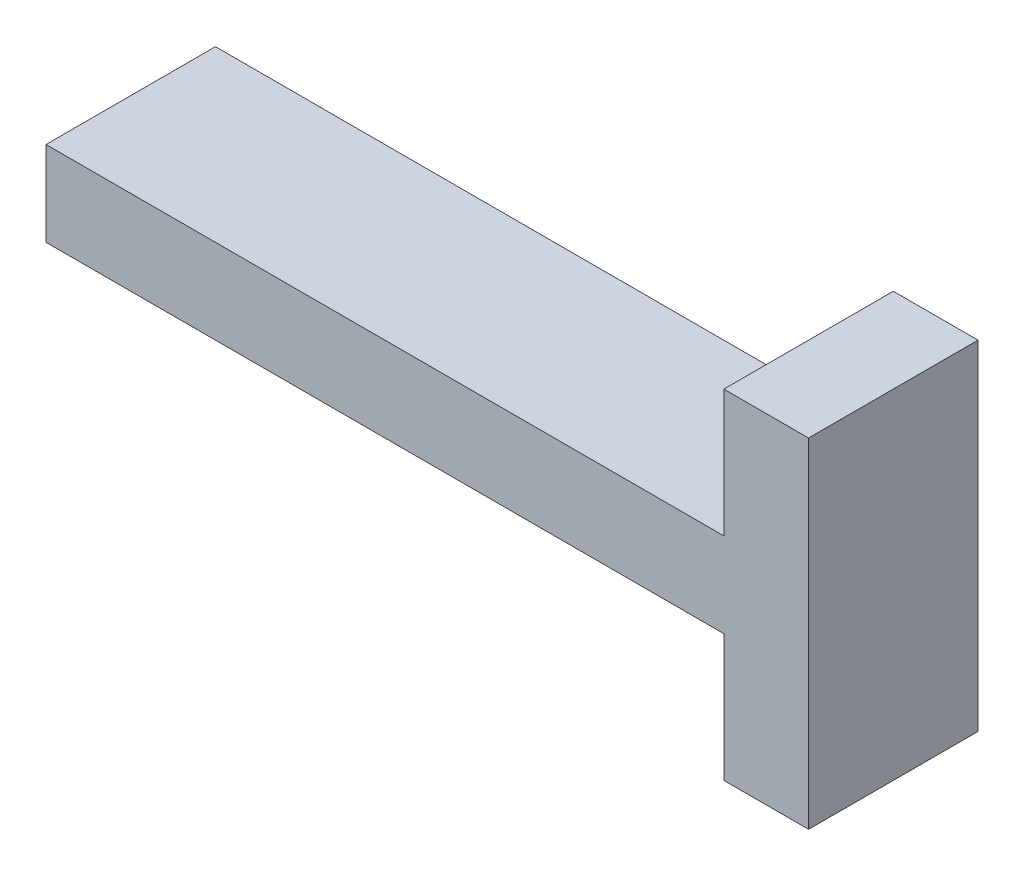
ISO-10303-21;
HEADER;
FILE_DESCRIPTION(('STEP AP214'),'2;1');
FILE_NAME('part.step','',(''),(''),'','','');
FILE_SCHEMA(('AUTOMOTIVE_DESIGN { 1 0 10303 214 1 1 1 1 }'));
ENDSEC;
DATA;
#1=APPLICATION_CONTEXT('core data for automotive mechanical design processes');
#2=APPLICATION_PROTOCOL_DEFINITION('international standard','automotive_design',2000,#1);
#3=PRODUCT_CONTEXT('',#1,'mechanical');
#4=PRODUCT('Part','Part','',(#3));
#5=PRODUCT_RELATED_PRODUCT_CATEGORY('part','',(#4));
#6=PRODUCT_DEFINITION_FORMATION('','',#4);
#7=PRODUCT_DEFINITION_CONTEXT('part definition',#1,'design');
#8=PRODUCT_DEFINITION('design','',#6,#7);
#9=PRODUCT_DEFINITION_SHAPE('','',#8);
#10=(LENGTH_UNIT() NAMED_UNIT(*) SI_UNIT(.MILLI.,.METRE.));
#11=(NAMED_UNIT(*) PLANE_ANGLE_UNIT() SI_UNIT($,.RADIAN.));
#12=(NAMED_UNIT(*) SI_UNIT($,.STERADIAN.) SOLID_ANGLE_UNIT());
#13=UNCERTAINTY_MEASURE_WITH_UNIT(LENGTH_MEASURE(1.E-05),#10,'distance_accuracy_value','');
#14=(GEOMETRIC_REPRESENTATION_CONTEXT(3) GLOBAL_UNCERTAINTY_ASSIGNED_CONTEXT((#13)) GLOBAL_UNIT_ASSIGNED_CONTEXT((#10,
#11,#12)) REPRESENTATION_CONTEXT('',''));
#15=CARTESIAN_POINT('',(0.,0.,0.));
#16=DIRECTION('',(0.,0.,1.));
#17=DIRECTION('',(1.,0.,0.));
#18=AXIS2_PLACEMENT_3D('',#15,#16,#17);
#19=CARTESIAN_POINT('',(-80.,0.,20.));
#20=DIRECTION('',(0.,-1.,0.));
#21=DIRECTION('',(1.,0.,0.));
#22=AXIS2_PLACEMENT_3D('',#19,#20,#21);
#23=PLANE('',#22);
#24=DIRECTION('',(-1.,0.,0.));
#25=VECTOR('',#24,1.);
#26=CARTESIAN_POINT('',(-80.,0.,0.));
#27=LINE('',#26,#25);
#28=CARTESIAN_POINT('',(0.,0.,0.));
#29=VERTEX_POINT('',#28);
#30=CARTESIAN_POINT('',(-80.,0.,0.));
#31=VERTEX_POINT('',#30);
#32=EDGE_CURVE('E222',#29,#31,#27,.T.);
#33=ORIENTED_EDGE('',*,*,#32,.T.);
#34=DIRECTION('',(0.,0.,-1.));
#35=VECTOR('',#34,1.);
#36=CARTESIAN_POINT('',(-80.,0.,20.));
#37=LINE('',#36,#35);
#38=CARTESIAN_POINT('',(-80.,0.,20.));
#39=VERTEX_POINT('',#38);
#40=EDGE_CURVE('E12',#39,#31,#37,.T.);
#41=ORIENTED_EDGE('',*,*,#40,.F.);
#42=DIRECTION('',(-1.,0.,0.));
#43=VECTOR('',#42,1.);
#44=CARTESIAN_POINT('',(-80.,0.,20.));
#45=LINE('',#44,#43);
#46=CARTESIAN_POINT('',(0.,0.,20.));
#47=VERTEX_POINT('',#46);
#48=EDGE_CURVE('E164',#47,#39,#45,.T.);
#49=ORIENTED_EDGE('',*,*,#48,.F.);
#50=DIRECTION('',(0.,0.,-1.));
#51=VECTOR('',#50,1.);
#52=CARTESIAN_POINT('',(0.,0.,20.));
#53=LINE('',#52,#51);
#54=EDGE_CURVE('E145',#47,#29,#53,.T.);
#55=ORIENTED_EDGE('',*,*,#54,.T.);
#56=EDGE_LOOP('',(#33,#41,#49,#55));
#57=FACE_BOUND('',#56,.T.);
#58=ADVANCED_FACE('F47',(#57),#23,.F.);
#59=CARTESIAN_POINT('',(-80.,-10.,20.));
#60=DIRECTION('',(1.,0.,0.));
#61=DIRECTION('',(0.,0.,-1.));
#62=AXIS2_PLACEMENT_3D('',#59,#60,#61);
#63=PLANE('',#62);
#64=DIRECTION('',(0.,-1.,0.));
#65=VECTOR('',#64,1.);
#66=CARTESIAN_POINT('',(-80.,-10.,0.));
#67=LINE('',#66,#65);
#68=CARTESIAN_POINT('',(-80.,-10.,0.));
#69=VERTEX_POINT('',#68);
#70=EDGE_CURVE('E215',#31,#69,#67,.T.);
#71=ORIENTED_EDGE('',*,*,#70,.T.);
#72=DIRECTION('',(0.,0.,-1.));
#73=VECTOR('',#72,1.);
#74=CARTESIAN_POINT('',(-80.,-10.,20.));
#75=LINE('',#74,#73);
#76=CARTESIAN_POINT('',(-80.,-10.,20.));
#77=VERTEX_POINT('',#76);
#78=EDGE_CURVE('E57',#77,#69,#75,.T.);
#79=ORIENTED_EDGE('',*,*,#78,.F.);
#80=DIRECTION('',(0.,-1.,0.));
#81=VECTOR('',#80,1.);
#82=CARTESIAN_POINT('',(-80.,-10.,20.));
#83=LINE('',#82,#81);
#84=EDGE_CURVE('E108',#39,#77,#83,.T.);
#85=ORIENTED_EDGE('',*,*,#84,.F.);
#86=ORIENTED_EDGE('',*,*,#40,.T.);
#87=EDGE_LOOP('',(#71,#79,#85,#86));
#88=FACE_BOUND('',#87,.T.);
#89=ADVANCED_FACE('F249',(#88),#63,.F.);
#90=CARTESIAN_POINT('',(0.,-10.,20.));
#91=DIRECTION('',(0.,1.,0.));
#92=DIRECTION('',(0.,0.,1.));
#93=AXIS2_PLACEMENT_3D('',#90,#91,#92);
#94=PLANE('',#93);
#95=DIRECTION('',(1.,0.,0.));
#96=VECTOR('',#95,1.);
#97=CARTESIAN_POINT('',(0.,-10.,0.));
#98=LINE('',#97,#96);
#99=CARTESIAN_POINT('',(0.,-10.,0.));
#100=VERTEX_POINT('',#99);
#101=EDGE_CURVE('E210',#69,#100,#98,.T.);
#102=ORIENTED_EDGE('',*,*,#101,.T.);
#103=DIRECTION('',(0.,0.,-1.));
#104=VECTOR('',#103,1.);
#105=CARTESIAN_POINT('',(0.,-10.,20.));
#106=LINE('',#105,#104);
#107=CARTESIAN_POINT('',(0.,-10.,20.));
#108=VERTEX_POINT('',#107);
#109=EDGE_CURVE('E199',#108,#100,#106,.T.);
#110=ORIENTED_EDGE('',*,*,#109,.F.);
#111=DIRECTION('',(1.,0.,0.));
#112=VECTOR('',#111,1.);
#113=CARTESIAN_POINT('',(0.,-10.,20.));
#114=LINE('',#113,#112);
#115=EDGE_CURVE('E163',#77,#108,#114,.T.);
#116=ORIENTED_EDGE('',*,*,#115,.F.);
#117=ORIENTED_EDGE('',*,*,#78,.T.);
#118=EDGE_LOOP('',(#102,#110,#116,#117));
#119=FACE_BOUND('',#118,.T.);
#120=ADVANCED_FACE('F208',(#119),#94,.F.);
#121=CARTESIAN_POINT('',(0.,-25.,20.));
#122=DIRECTION('',(1.,0.,0.));
#123=DIRECTION('',(0.,1.,0.));
#124=AXIS2_PLACEMENT_3D('',#121,#122,#123);
#125=PLANE('',#124);
#126=DIRECTION('',(0.,-1.,0.));
#127=VECTOR('',#126,1.);
#128=CARTESIAN_POINT('',(0.,-25.,0.));
#129=LINE('',#128,#127);
#130=CARTESIAN_POINT('',(0.,-25.,0.));
#131=VERTEX_POINT('',#130);
#132=EDGE_CURVE('E217',#100,#131,#129,.T.);
#133=ORIENTED_EDGE('',*,*,#132,.T.);
#134=DIRECTION('',(0.,0.,-1.));
#135=VECTOR('',#134,1.);
#136=CARTESIAN_POINT('',(0.,-25.,20.));
#137=LINE('',#136,#135);
#138=CARTESIAN_POINT('',(0.,-25.,20.));
#139=VERTEX_POINT('',#138);
#140=EDGE_CURVE('E195',#139,#131,#137,.T.);
#141=ORIENTED_EDGE('',*,*,#140,.F.);
#142=DIRECTION('',(0.,-1.,0.));
#143=VECTOR('',#142,1.);
#144=CARTESIAN_POINT('',(0.,-25.,20.));
#145=LINE('',#144,#143);
#146=EDGE_CURVE('E170',#108,#139,#145,.T.);
#147=ORIENTED_EDGE('',*,*,#146,.F.);
#148=ORIENTED_EDGE('',*,*,#109,.T.);
#149=EDGE_LOOP('',(#133,#141,#147,#148));
#150=FACE_BOUND('',#149,.T.);
#151=ADVANCED_FACE('F238',(#150),#125,.F.);
#152=CARTESIAN_POINT('',(10.,-25.,20.));
#153=DIRECTION('',(0.,1.,0.));
#154=DIRECTION('',(0.,0.,1.));
#155=AXIS2_PLACEMENT_3D('',#152,#153,#154);
#156=PLANE('',#155);
#157=DIRECTION('',(1.,0.,0.));
#158=VECTOR('',#157,1.);
#159=CARTESIAN_POINT('',(10.,-25.,0.));
#160=LINE('',#159,#158);
#161=CARTESIAN_POINT('',(10.,-25.,0.));
#162=VERTEX_POINT('',#161);
#163=EDGE_CURVE('E183',#131,#162,#160,.T.);
#164=ORIENTED_EDGE('',*,*,#163,.T.);
#165=DIRECTION('',(0.,0.,-1.));
#166=VECTOR('',#165,1.);
#167=CARTESIAN_POINT('',(10.,-25.,20.));
#168=LINE('',#167,#166);
#169=CARTESIAN_POINT('',(10.,-25.,20.));
#170=VERTEX_POINT('',#169);
#171=EDGE_CURVE('E138',#170,#162,#168,.T.);
#172=ORIENTED_EDGE('',*,*,#171,.F.);
#173=DIRECTION('',(1.,0.,0.));
#174=VECTOR('',#173,1.);
#175=CARTESIAN_POINT('',(10.,-25.,20.));
#176=LINE('',#175,#174);
#177=EDGE_CURVE('E127',#139,#170,#176,.T.);
#178=ORIENTED_EDGE('',*,*,#177,.F.);
#179=ORIENTED_EDGE('',*,*,#140,.T.);
#180=EDGE_LOOP('',(#164,#172,#178,#179));
#181=FACE_BOUND('',#180,.T.);
#182=ADVANCED_FACE('F239',(#181),#156,.F.);
#183=CARTESIAN_POINT('',(10.,15.,20.));
#184=DIRECTION('',(-1.,0.,0.));
#185=DIRECTION('',(0.,-1.,0.));
#186=AXIS2_PLACEMENT_3D('',#183,#184,#185);
#187=PLANE('',#186);
#188=DIRECTION('',(0.,1.,0.));
#189=VECTOR('',#188,1.);
#190=CARTESIAN_POINT('',(10.,15.,0.));
#191=LINE('',#190,#189);
#192=CARTESIAN_POINT('',(10.,15.,0.));
#193=VERTEX_POINT('',#192);
#194=EDGE_CURVE('E136',#162,#193,#191,.T.);
#195=ORIENTED_EDGE('',*,*,#194,.T.);
#196=DIRECTION('',(0.,0.,-1.));
#197=VECTOR('',#196,1.);
#198=CARTESIAN_POINT('',(10.,15.,20.));
#199=LINE('',#198,#197);
#200=CARTESIAN_POINT('',(10.,15.,20.));
#201=VERTEX_POINT('',#200);
#202=EDGE_CURVE('E133',#201,#193,#199,.T.);
#203=ORIENTED_EDGE('',*,*,#202,.F.);
#204=DIRECTION('',(0.,1.,0.));
#205=VECTOR('',#204,1.);
#206=CARTESIAN_POINT('',(10.,15.,20.));
#207=LINE('',#206,#205);
#208=EDGE_CURVE('E121',#170,#201,#207,.T.);
#209=ORIENTED_EDGE('',*,*,#208,.F.);
#210=ORIENTED_EDGE('',*,*,#171,.T.);
#211=EDGE_LOOP('',(#195,#203,#209,#210));
#212=FACE_BOUND('',#211,.T.);
#213=ADVANCED_FACE('F134',(#212),#187,.F.);
#214=CARTESIAN_POINT('',(0.,15.,20.));
#215=DIRECTION('',(0.,-1.,0.));
#216=DIRECTION('',(0.,0.,-1.));
#217=AXIS2_PLACEMENT_3D('',#214,#215,#216);
#218=PLANE('',#217);
#219=DIRECTION('',(-1.,0.,0.));
#220=VECTOR('',#219,1.);
#221=CARTESIAN_POINT('',(0.,15.,0.));
#222=LINE('',#221,#220);
#223=CARTESIAN_POINT('',(0.,15.,0.));
#224=VERTEX_POINT('',#223);
#225=EDGE_CURVE('E94',#193,#224,#222,.T.);
#226=ORIENTED_EDGE('',*,*,#225,.T.);
#227=DIRECTION('',(0.,0.,-1.));
#228=VECTOR('',#227,1.);
#229=CARTESIAN_POINT('',(0.,15.,20.));
#230=LINE('',#229,#228);
#231=CARTESIAN_POINT('',(0.,15.,20.));
#232=VERTEX_POINT('',#231);
#233=EDGE_CURVE('E139',#232,#224,#230,.T.);
#234=ORIENTED_EDGE('',*,*,#233,.F.);
#235=DIRECTION('',(-1.,0.,0.));
#236=VECTOR('',#235,1.);
#237=CARTESIAN_POINT('',(0.,15.,20.));
#238=LINE('',#237,#236);
#239=EDGE_CURVE('E125',#201,#232,#238,.T.);
#240=ORIENTED_EDGE('',*,*,#239,.F.);
#241=ORIENTED_EDGE('',*,*,#202,.T.);
#242=EDGE_LOOP('',(#226,#234,#240,#241));
#243=FACE_BOUND('',#242,.T.);
#244=ADVANCED_FACE('F141',(#243),#218,.F.);
#245=CARTESIAN_POINT('',(0.,0.,20.));
#246=DIRECTION('',(1.,0.,0.));
#247=DIRECTION('',(0.,0.,-1.));
#248=AXIS2_PLACEMENT_3D('',#245,#246,#247);
#249=PLANE('',#248);
#250=DIRECTION('',(0.,-1.,0.));
#251=VECTOR('',#250,1.);
#252=CARTESIAN_POINT('',(0.,0.,0.));
#253=LINE('',#252,#251);
#254=EDGE_CURVE('E100',#224,#29,#253,.T.);
#255=ORIENTED_EDGE('',*,*,#254,.T.);
#256=ORIENTED_EDGE('',*,*,#54,.F.);
#257=DIRECTION('',(0.,-1.,0.));
#258=VECTOR('',#257,1.);
#259=CARTESIAN_POINT('',(0.,0.,20.));
#260=LINE('',#259,#258);
#261=EDGE_CURVE('E65',#232,#47,#260,.T.);
#262=ORIENTED_EDGE('',*,*,#261,.F.);
#263=ORIENTED_EDGE('',*,*,#233,.T.);
#264=EDGE_LOOP('',(#255,#256,#262,#263));
#265=FACE_BOUND('',#264,.T.);
#266=ADVANCED_FACE('F285',(#265),#249,.F.);
#267=CARTESIAN_POINT('',(0.,0.,20.));
#268=DIRECTION('',(0.,0.,1.));
#269=DIRECTION('',(1.,0.,0.));
#270=AXIS2_PLACEMENT_3D('',#267,#268,#269);
#271=PLANE('',#270);
#272=ORIENTED_EDGE('',*,*,#48,.T.);
#273=ORIENTED_EDGE('',*,*,#84,.T.);
#274=ORIENTED_EDGE('',*,*,#115,.T.);
#275=ORIENTED_EDGE('',*,*,#146,.T.);
#276=ORIENTED_EDGE('',*,*,#177,.T.);
#277=ORIENTED_EDGE('',*,*,#208,.T.);
#278=ORIENTED_EDGE('',*,*,#239,.T.);
#279=ORIENTED_EDGE('',*,*,#261,.T.);
#280=EDGE_LOOP('',(#272,#273,#274,#275,#276,#277,#278,#279));
#281=FACE_BOUND('',#280,.T.);
#282=ADVANCED_FACE('F123',(#281),#271,.T.);
#283=CARTESIAN_POINT('',(0.,0.,0.));
#284=DIRECTION('',(0.,0.,1.));
#285=DIRECTION('',(1.,0.,0.));
#286=AXIS2_PLACEMENT_3D('',#283,#284,#285);
#287=PLANE('',#286);
#288=ORIENTED_EDGE('',*,*,#32,.F.);
#289=ORIENTED_EDGE('',*,*,#254,.F.);
#290=ORIENTED_EDGE('',*,*,#225,.F.);
#291=ORIENTED_EDGE('',*,*,#194,.F.);
#292=ORIENTED_EDGE('',*,*,#163,.F.);
#293=ORIENTED_EDGE('',*,*,#132,.F.);
#294=ORIENTED_EDGE('',*,*,#101,.F.);
#295=ORIENTED_EDGE('',*,*,#70,.F.);
#296=EDGE_LOOP('',(#288,#289,#290,#291,#292,#293,#294,#295));
#297=FACE_BOUND('',#296,.T.);
#298=ADVANCED_FACE('F214',(#297),#287,.F.);
#299=CLOSED_SHELL('',(#58,#89,#120,#151,#182,#213,#244,#266,#282,#298));
#300=MANIFOLD_SOLID_BREP('B2',#299);
#301=ADVANCED_BREP_SHAPE_REPRESENTATION('',(#18,#300),#14);
#302=SHAPE_DEFINITION_REPRESENTATION(#9,#301);
ENDSEC;
END-ISO-10303-21;
